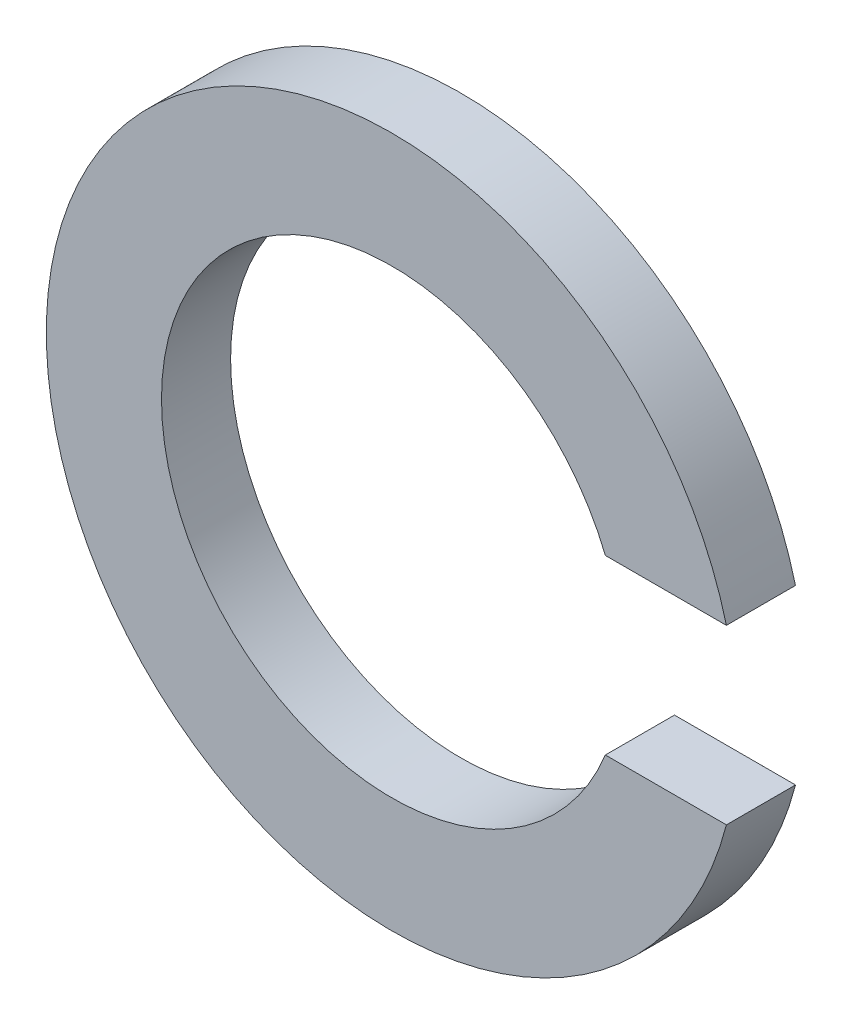
ISO-10303-21;
HEADER;
FILE_DESCRIPTION(('STEP AP214'),'2;1');
FILE_NAME('part.step','',(''),(''),'','','');
FILE_SCHEMA(('AUTOMOTIVE_DESIGN { 1 0 10303 214 1 1 1 1 }'));
ENDSEC;
DATA;
#1=APPLICATION_CONTEXT('core data for automotive mechanical design processes');
#2=APPLICATION_PROTOCOL_DEFINITION('international standard','automotive_design',2000,#1);
#3=PRODUCT_CONTEXT('',#1,'mechanical');
#4=PRODUCT('Part','Part','',(#3));
#5=PRODUCT_RELATED_PRODUCT_CATEGORY('part','',(#4));
#6=PRODUCT_DEFINITION_FORMATION('','',#4);
#7=PRODUCT_DEFINITION_CONTEXT('part definition',#1,'design');
#8=PRODUCT_DEFINITION('design','',#6,#7);
#9=PRODUCT_DEFINITION_SHAPE('','',#8);
#10=(LENGTH_UNIT() NAMED_UNIT(*) SI_UNIT(.MILLI.,.METRE.));
#11=(NAMED_UNIT(*) PLANE_ANGLE_UNIT() SI_UNIT($,.RADIAN.));
#12=(NAMED_UNIT(*) SI_UNIT($,.STERADIAN.) SOLID_ANGLE_UNIT());
#13=UNCERTAINTY_MEASURE_WITH_UNIT(LENGTH_MEASURE(1.E-05),#10,'distance_accuracy_value','');
#14=(GEOMETRIC_REPRESENTATION_CONTEXT(3) GLOBAL_UNCERTAINTY_ASSIGNED_CONTEXT((#13)) GLOBAL_UNIT_ASSIGNED_CONTEXT((#10,
#11,#12)) REPRESENTATION_CONTEXT('',''));
#15=CARTESIAN_POINT('',(0.,0.,0.));
#16=DIRECTION('',(0.,0.,1.));
#17=DIRECTION('',(1.,0.,0.));
#18=AXIS2_PLACEMENT_3D('',#15,#16,#17);
#19=CARTESIAN_POINT('',(0.,0.,0.6));
#20=DIRECTION('',(0.,0.,-1.));
#21=DIRECTION('',(-1.,0.,0.));
#22=AXIS2_PLACEMENT_3D('',#19,#20,#21);
#23=CYLINDRICAL_SURFACE('',#22,2.);
#24=CARTESIAN_POINT('',(0.,0.,0.));
#25=DIRECTION('',(0.,0.,-1.));
#26=DIRECTION('',(1.,0.,0.));
#27=AXIS2_PLACEMENT_3D('',#24,#25,#26);
#28=CIRCLE('',#27,2.);
#29=CARTESIAN_POINT('',(1.85404962177392,-0.75,0.));
#30=VERTEX_POINT('',#29);
#31=CARTESIAN_POINT('',(1.85404962177392,0.75,0.));
#32=VERTEX_POINT('',#31);
#33=EDGE_CURVE('E100',#30,#32,#28,.T.);
#34=ORIENTED_EDGE('',*,*,#33,.T.);
#35=DIRECTION('',(0.,0.,-1.));
#36=VECTOR('',#35,1.);
#37=CARTESIAN_POINT('',(1.85404962177392,0.75,0.6));
#38=LINE('',#37,#36);
#39=CARTESIAN_POINT('',(1.85404962177392,0.75,0.6));
#40=VERTEX_POINT('',#39);
#41=EDGE_CURVE('E11',#40,#32,#38,.T.);
#42=ORIENTED_EDGE('',*,*,#41,.F.);
#43=CARTESIAN_POINT('',(0.,0.,0.6));
#44=DIRECTION('',(0.,0.,-1.));
#45=DIRECTION('',(1.,0.,0.));
#46=AXIS2_PLACEMENT_3D('',#43,#44,#45);
#47=CIRCLE('',#46,2.);
#48=CARTESIAN_POINT('',(1.85404962177392,-0.75,0.6));
#49=VERTEX_POINT('',#48);
#50=EDGE_CURVE('E88',#49,#40,#47,.T.);
#51=ORIENTED_EDGE('',*,*,#50,.F.);
#52=DIRECTION('',(0.,0.,-1.));
#53=VECTOR('',#52,1.);
#54=CARTESIAN_POINT('',(1.85404962177392,-0.75,0.6));
#55=LINE('',#54,#53);
#56=EDGE_CURVE('E96',#49,#30,#55,.T.);
#57=ORIENTED_EDGE('',*,*,#56,.T.);
#58=EDGE_LOOP('',(#34,#42,#51,#57));
#59=FACE_BOUND('',#58,.T.);
#60=ADVANCED_FACE('F37',(#59),#23,.F.);
#61=CARTESIAN_POINT('',(1.85404962177392,0.75,0.6));
#62=DIRECTION('',(0.,1.,0.));
#63=DIRECTION('',(0.,0.,1.));
#64=AXIS2_PLACEMENT_3D('',#61,#62,#63);
#65=PLANE('',#64);
#66=DIRECTION('',(1.,0.,0.));
#67=VECTOR('',#66,1.);
#68=CARTESIAN_POINT('',(1.85404962177392,0.75,0.));
#69=LINE('',#68,#67);
#70=CARTESIAN_POINT('',(2.90473750965556,0.75,0.));
#71=VERTEX_POINT('',#70);
#72=EDGE_CURVE('E92',#32,#71,#69,.T.);
#73=ORIENTED_EDGE('',*,*,#72,.T.);
#74=DIRECTION('',(0.,0.,-1.));
#75=VECTOR('',#74,1.);
#76=CARTESIAN_POINT('',(2.90473750965556,0.75,0.6));
#77=LINE('',#76,#75);
#78=CARTESIAN_POINT('',(2.90473750965556,0.75,0.6));
#79=VERTEX_POINT('',#78);
#80=EDGE_CURVE('E45',#79,#71,#77,.T.);
#81=ORIENTED_EDGE('',*,*,#80,.F.);
#82=DIRECTION('',(1.,0.,0.));
#83=VECTOR('',#82,1.);
#84=CARTESIAN_POINT('',(1.85404962177392,0.75,0.6));
#85=LINE('',#84,#83);
#86=EDGE_CURVE('E83',#40,#79,#85,.T.);
#87=ORIENTED_EDGE('',*,*,#86,.F.);
#88=ORIENTED_EDGE('',*,*,#41,.T.);
#89=EDGE_LOOP('',(#73,#81,#87,#88));
#90=FACE_BOUND('',#89,.T.);
#91=ADVANCED_FACE('F91',(#90),#65,.F.);
#92=CARTESIAN_POINT('',(0.,0.,0.6));
#93=DIRECTION('',(0.,0.,-1.));
#94=DIRECTION('',(-1.,0.,0.));
#95=AXIS2_PLACEMENT_3D('',#92,#93,#94);
#96=CYLINDRICAL_SURFACE('',#95,3.);
#97=CARTESIAN_POINT('',(0.,0.,0.));
#98=DIRECTION('',(0.,0.,1.));
#99=DIRECTION('',(1.,0.,0.));
#100=AXIS2_PLACEMENT_3D('',#97,#98,#99);
#101=CIRCLE('',#100,3.);
#102=CARTESIAN_POINT('',(2.90473750965556,-0.750000000000001,0.));
#103=VERTEX_POINT('',#102);
#104=EDGE_CURVE('E70',#71,#103,#101,.T.);
#105=ORIENTED_EDGE('',*,*,#104,.T.);
#106=DIRECTION('',(0.,0.,-1.));
#107=VECTOR('',#106,1.);
#108=CARTESIAN_POINT('',(2.90473750965556,-0.750000000000001,0.6));
#109=LINE('',#108,#107);
#110=CARTESIAN_POINT('',(2.90473750965556,-0.750000000000001,0.6));
#111=VERTEX_POINT('',#110);
#112=EDGE_CURVE('E93',#111,#103,#109,.T.);
#113=ORIENTED_EDGE('',*,*,#112,.F.);
#114=CARTESIAN_POINT('',(0.,0.,0.6));
#115=DIRECTION('',(0.,0.,1.));
#116=DIRECTION('',(1.,0.,0.));
#117=AXIS2_PLACEMENT_3D('',#114,#115,#116);
#118=CIRCLE('',#117,3.);
#119=EDGE_CURVE('E86',#79,#111,#118,.T.);
#120=ORIENTED_EDGE('',*,*,#119,.F.);
#121=ORIENTED_EDGE('',*,*,#80,.T.);
#122=EDGE_LOOP('',(#105,#113,#120,#121));
#123=FACE_BOUND('',#122,.T.);
#124=ADVANCED_FACE('F94',(#123),#96,.T.);
#125=CARTESIAN_POINT('',(1.85404962177392,-0.75,0.6));
#126=DIRECTION('',(0.,-1.,0.));
#127=DIRECTION('',(0.,0.,-1.));
#128=AXIS2_PLACEMENT_3D('',#125,#126,#127);
#129=PLANE('',#128);
#130=DIRECTION('',(-1.,0.,0.));
#131=VECTOR('',#130,1.);
#132=CARTESIAN_POINT('',(1.85404962177392,-0.75,0.));
#133=LINE('',#132,#131);
#134=EDGE_CURVE('E76',#103,#30,#133,.T.);
#135=ORIENTED_EDGE('',*,*,#134,.T.);
#136=ORIENTED_EDGE('',*,*,#56,.F.);
#137=DIRECTION('',(-1.,0.,0.));
#138=VECTOR('',#137,1.);
#139=CARTESIAN_POINT('',(1.85404962177392,-0.75,0.6));
#140=LINE('',#139,#138);
#141=EDGE_CURVE('E53',#111,#49,#140,.T.);
#142=ORIENTED_EDGE('',*,*,#141,.F.);
#143=ORIENTED_EDGE('',*,*,#112,.T.);
#144=EDGE_LOOP('',(#135,#136,#142,#143));
#145=FACE_BOUND('',#144,.T.);
#146=ADVANCED_FACE('F107',(#145),#129,.F.);
#147=CARTESIAN_POINT('',(0.,0.,0.6));
#148=DIRECTION('',(0.,0.,1.));
#149=DIRECTION('',(1.,0.,0.));
#150=AXIS2_PLACEMENT_3D('',#147,#148,#149);
#151=PLANE('',#150);
#152=ORIENTED_EDGE('',*,*,#50,.T.);
#153=ORIENTED_EDGE('',*,*,#86,.T.);
#154=ORIENTED_EDGE('',*,*,#119,.T.);
#155=ORIENTED_EDGE('',*,*,#141,.T.);
#156=EDGE_LOOP('',(#152,#153,#154,#155));
#157=FACE_BOUND('',#156,.T.);
#158=ADVANCED_FACE('F84',(#157),#151,.T.);
#159=CARTESIAN_POINT('',(0.,0.,0.));
#160=DIRECTION('',(0.,0.,1.));
#161=DIRECTION('',(1.,0.,0.));
#162=AXIS2_PLACEMENT_3D('',#159,#160,#161);
#163=PLANE('',#162);
#164=ORIENTED_EDGE('',*,*,#33,.F.);
#165=ORIENTED_EDGE('',*,*,#134,.F.);
#166=ORIENTED_EDGE('',*,*,#104,.F.);
#167=ORIENTED_EDGE('',*,*,#72,.F.);
#168=EDGE_LOOP('',(#164,#165,#166,#167));
#169=FACE_BOUND('',#168,.T.);
#170=ADVANCED_FACE('F110',(#169),#163,.F.);
#171=CLOSED_SHELL('',(#60,#91,#124,#146,#158,#170));
#172=MANIFOLD_SOLID_BREP('B2',#171);
#173=ADVANCED_BREP_SHAPE_REPRESENTATION('',(#18,#172),#14);
#174=SHAPE_DEFINITION_REPRESENTATION(#9,#173);
ENDSEC;
END-ISO-10303-21;
